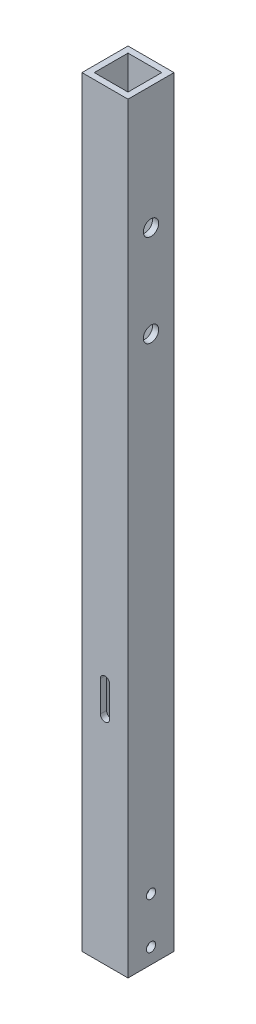
ISO-10303-21;
HEADER;
FILE_DESCRIPTION(('STEP AP214'),'2;1');
FILE_NAME('part.step','',(''),(''),'','','');
FILE_SCHEMA(('AUTOMOTIVE_DESIGN { 1 0 10303 214 1 1 1 1 }'));
ENDSEC;
DATA;
#1=APPLICATION_CONTEXT('core data for automotive mechanical design processes');
#2=APPLICATION_PROTOCOL_DEFINITION('international standard','automotive_design',2000,#1);
#3=PRODUCT_CONTEXT('',#1,'mechanical');
#4=PRODUCT('Part','Part','',(#3));
#5=PRODUCT_RELATED_PRODUCT_CATEGORY('part','',(#4));
#6=PRODUCT_DEFINITION_FORMATION('','',#4);
#7=PRODUCT_DEFINITION_CONTEXT('part definition',#1,'design');
#8=PRODUCT_DEFINITION('design','',#6,#7);
#9=PRODUCT_DEFINITION_SHAPE('','',#8);
#10=(LENGTH_UNIT() NAMED_UNIT(*) SI_UNIT(.MILLI.,.METRE.));
#11=(NAMED_UNIT(*) PLANE_ANGLE_UNIT() SI_UNIT($,.RADIAN.));
#12=(NAMED_UNIT(*) SI_UNIT($,.STERADIAN.) SOLID_ANGLE_UNIT());
#13=UNCERTAINTY_MEASURE_WITH_UNIT(LENGTH_MEASURE(1.E-05),#10,'distance_accuracy_value','');
#14=(GEOMETRIC_REPRESENTATION_CONTEXT(3) GLOBAL_UNCERTAINTY_ASSIGNED_CONTEXT((#13)) GLOBAL_UNIT_ASSIGNED_CONTEXT((#10,
#11,#12)) REPRESENTATION_CONTEXT('',''));
#15=CARTESIAN_POINT('',(0.,0.,0.));
#16=DIRECTION('',(0.,0.,1.));
#17=DIRECTION('',(1.,0.,0.));
#18=AXIS2_PLACEMENT_3D('',#15,#16,#17);
#19=CARTESIAN_POINT('',(-7.5,20.,0.));
#20=DIRECTION('',(1.,0.,0.));
#21=DIRECTION('',(0.,0.,-1.));
#22=AXIS2_PLACEMENT_3D('',#19,#20,#21);
#23=CYLINDRICAL_SURFACE('',#22,1.5);
#24=CARTESIAN_POINT('',(5.5,20.,0.));
#25=DIRECTION('',(1.,0.,0.));
#26=DIRECTION('',(0.,0.,-1.));
#27=AXIS2_PLACEMENT_3D('',#24,#25,#26);
#28=CIRCLE('',#27,1.5);
#29=CARTESIAN_POINT('',(5.5,20.,-1.5));
#30=VERTEX_POINT('',#29);
#31=EDGE_CURVE('E214',#30,#30,#28,.F.);
#32=ORIENTED_EDGE('',*,*,#31,.T.);
#33=EDGE_LOOP('',(#32));
#34=FACE_BOUND('',#33,.T.);
#35=CARTESIAN_POINT('',(7.5,20.,0.));
#36=DIRECTION('',(1.,0.,0.));
#37=DIRECTION('',(0.,0.,-1.));
#38=AXIS2_PLACEMENT_3D('',#35,#36,#37);
#39=CIRCLE('',#38,1.5);
#40=CARTESIAN_POINT('',(7.5,20.,-1.5));
#41=VERTEX_POINT('',#40);
#42=EDGE_CURVE('E245',#41,#41,#39,.T.);
#43=ORIENTED_EDGE('',*,*,#42,.T.);
#44=EDGE_LOOP('',(#43));
#45=FACE_BOUND('',#44,.T.);
#46=ADVANCED_FACE('F35',(#34,#45),#23,.F.);
#47=CARTESIAN_POINT('',(-7.5,5.,0.));
#48=DIRECTION('',(1.,0.,0.));
#49=DIRECTION('',(0.,0.,-1.));
#50=AXIS2_PLACEMENT_3D('',#47,#48,#49);
#51=CYLINDRICAL_SURFACE('',#50,1.5);
#52=CARTESIAN_POINT('',(5.5,5.,0.));
#53=DIRECTION('',(1.,0.,0.));
#54=DIRECTION('',(0.,0.,-1.));
#55=AXIS2_PLACEMENT_3D('',#52,#53,#54);
#56=CIRCLE('',#55,1.5);
#57=CARTESIAN_POINT('',(5.5,5.,-1.5));
#58=VERTEX_POINT('',#57);
#59=EDGE_CURVE('E213',#58,#58,#56,.F.);
#60=ORIENTED_EDGE('',*,*,#59,.T.);
#61=EDGE_LOOP('',(#60));
#62=FACE_BOUND('',#61,.T.);
#63=CARTESIAN_POINT('',(7.5,5.,0.));
#64=DIRECTION('',(1.,0.,0.));
#65=DIRECTION('',(0.,0.,-1.));
#66=AXIS2_PLACEMENT_3D('',#63,#64,#65);
#67=CIRCLE('',#66,1.5);
#68=CARTESIAN_POINT('',(7.5,5.,-1.5));
#69=VERTEX_POINT('',#68);
#70=EDGE_CURVE('E262',#69,#69,#67,.T.);
#71=ORIENTED_EDGE('',*,*,#70,.T.);
#72=EDGE_LOOP('',(#71));
#73=FACE_BOUND('',#72,.T.);
#74=ADVANCED_FACE('F363',(#62,#73),#51,.F.);
#75=CARTESIAN_POINT('',(0.,70.,-7.5));
#76=DIRECTION('',(0.,0.,1.));
#77=DIRECTION('',(1.,0.,0.));
#78=AXIS2_PLACEMENT_3D('',#75,#76,#77);
#79=CYLINDRICAL_SURFACE('',#78,1.5);
#80=DIRECTION('',(0.,0.,1.));
#81=VECTOR('',#80,1.);
#82=CARTESIAN_POINT('',(1.5,70.,-7.5));
#83=LINE('',#82,#81);
#84=CARTESIAN_POINT('',(1.5,70.,5.5));
#85=VERTEX_POINT('',#84);
#86=CARTESIAN_POINT('',(1.5,70.,7.5));
#87=VERTEX_POINT('',#86);
#88=EDGE_CURVE('E231',#85,#87,#83,.T.);
#89=ORIENTED_EDGE('',*,*,#88,.F.);
#90=CARTESIAN_POINT('',(0.,70.,5.5));
#91=DIRECTION('',(0.,0.,1.));
#92=DIRECTION('',(1.,0.,0.));
#93=AXIS2_PLACEMENT_3D('',#90,#91,#92);
#94=CIRCLE('',#93,1.5);
#95=CARTESIAN_POINT('',(-1.5,70.,5.5));
#96=VERTEX_POINT('',#95);
#97=EDGE_CURVE('E206',#85,#96,#94,.F.);
#98=ORIENTED_EDGE('',*,*,#97,.T.);
#99=DIRECTION('',(0.,0.,1.));
#100=VECTOR('',#99,1.);
#101=CARTESIAN_POINT('',(-1.5,70.,-7.5));
#102=LINE('',#101,#100);
#103=CARTESIAN_POINT('',(-1.5,70.,7.5));
#104=VERTEX_POINT('',#103);
#105=EDGE_CURVE('E246',#96,#104,#102,.T.);
#106=ORIENTED_EDGE('',*,*,#105,.T.);
#107=CARTESIAN_POINT('',(0.,70.,7.5));
#108=DIRECTION('',(0.,0.,1.));
#109=DIRECTION('',(1.,0.,0.));
#110=AXIS2_PLACEMENT_3D('',#107,#108,#109);
#111=CIRCLE('',#110,1.5);
#112=EDGE_CURVE('E217',#104,#87,#111,.T.);
#113=ORIENTED_EDGE('',*,*,#112,.T.);
#114=EDGE_LOOP('',(#89,#98,#106,#113));
#115=FACE_BOUND('',#114,.T.);
#116=ADVANCED_FACE('F370',(#115),#79,.F.);
#117=CARTESIAN_POINT('',(-1.5,70.,-7.5));
#118=DIRECTION('',(-1.,0.,0.));
#119=DIRECTION('',(0.,-1.,0.));
#120=AXIS2_PLACEMENT_3D('',#117,#118,#119);
#121=PLANE('',#120);
#122=ORIENTED_EDGE('',*,*,#105,.F.);
#123=DIRECTION('',(0.,1.,0.));
#124=VECTOR('',#123,1.);
#125=CARTESIAN_POINT('',(-1.5,70.,5.5));
#126=LINE('',#125,#124);
#127=CARTESIAN_POINT('',(-1.5,80.,5.5));
#128=VERTEX_POINT('',#127);
#129=EDGE_CURVE('E203',#96,#128,#126,.T.);
#130=ORIENTED_EDGE('',*,*,#129,.T.);
#131=DIRECTION('',(0.,0.,1.));
#132=VECTOR('',#131,1.);
#133=CARTESIAN_POINT('',(-1.5,80.,-7.5));
#134=LINE('',#133,#132);
#135=CARTESIAN_POINT('',(-1.5,80.,7.5));
#136=VERTEX_POINT('',#135);
#137=EDGE_CURVE('E250',#128,#136,#134,.T.);
#138=ORIENTED_EDGE('',*,*,#137,.T.);
#139=DIRECTION('',(0.,-1.,0.));
#140=VECTOR('',#139,1.);
#141=CARTESIAN_POINT('',(-1.5,70.,7.5));
#142=LINE('',#141,#140);
#143=EDGE_CURVE('E222',#136,#104,#142,.T.);
#144=ORIENTED_EDGE('',*,*,#143,.T.);
#145=EDGE_LOOP('',(#122,#130,#138,#144));
#146=FACE_BOUND('',#145,.T.);
#147=ADVANCED_FACE('F413',(#146),#121,.F.);
#148=CARTESIAN_POINT('',(0.,80.,-7.5));
#149=DIRECTION('',(0.,0.,1.));
#150=DIRECTION('',(1.,0.,0.));
#151=AXIS2_PLACEMENT_3D('',#148,#149,#150);
#152=CYLINDRICAL_SURFACE('',#151,1.5);
#153=ORIENTED_EDGE('',*,*,#137,.F.);
#154=CARTESIAN_POINT('',(0.,80.,5.5));
#155=DIRECTION('',(0.,0.,1.));
#156=DIRECTION('',(1.,0.,0.));
#157=AXIS2_PLACEMENT_3D('',#154,#155,#156);
#158=CIRCLE('',#157,1.5);
#159=CARTESIAN_POINT('',(1.5,80.,5.5));
#160=VERTEX_POINT('',#159);
#161=EDGE_CURVE('E200',#128,#160,#158,.F.);
#162=ORIENTED_EDGE('',*,*,#161,.T.);
#163=DIRECTION('',(0.,0.,1.));
#164=VECTOR('',#163,1.);
#165=CARTESIAN_POINT('',(1.5,80.,-7.5));
#166=LINE('',#165,#164);
#167=CARTESIAN_POINT('',(1.5,80.,7.5));
#168=VERTEX_POINT('',#167);
#169=EDGE_CURVE('E254',#160,#168,#166,.T.);
#170=ORIENTED_EDGE('',*,*,#169,.T.);
#171=CARTESIAN_POINT('',(0.,80.,7.5));
#172=DIRECTION('',(0.,0.,1.));
#173=DIRECTION('',(1.,0.,0.));
#174=AXIS2_PLACEMENT_3D('',#171,#172,#173);
#175=CIRCLE('',#174,1.5);
#176=EDGE_CURVE('E237',#168,#136,#175,.T.);
#177=ORIENTED_EDGE('',*,*,#176,.T.);
#178=EDGE_LOOP('',(#153,#162,#170,#177));
#179=FACE_BOUND('',#178,.T.);
#180=ADVANCED_FACE('F417',(#179),#152,.F.);
#181=CARTESIAN_POINT('',(1.5,70.,-7.5));
#182=DIRECTION('',(1.,0.,0.));
#183=DIRECTION('',(0.,1.,0.));
#184=AXIS2_PLACEMENT_3D('',#181,#182,#183);
#185=PLANE('',#184);
#186=ORIENTED_EDGE('',*,*,#169,.F.);
#187=DIRECTION('',(0.,-1.,0.));
#188=VECTOR('',#187,1.);
#189=CARTESIAN_POINT('',(1.5,70.,5.5));
#190=LINE('',#189,#188);
#191=EDGE_CURVE('E11',#160,#85,#190,.T.);
#192=ORIENTED_EDGE('',*,*,#191,.T.);
#193=ORIENTED_EDGE('',*,*,#88,.T.);
#194=DIRECTION('',(0.,1.,0.));
#195=VECTOR('',#194,1.);
#196=CARTESIAN_POINT('',(1.5,70.,7.5));
#197=LINE('',#196,#195);
#198=EDGE_CURVE('E234',#87,#168,#197,.T.);
#199=ORIENTED_EDGE('',*,*,#198,.T.);
#200=EDGE_LOOP('',(#186,#192,#193,#199));
#201=FACE_BOUND('',#200,.T.);
#202=ADVANCED_FACE('F361',(#201),#185,.F.);
#203=CARTESIAN_POINT('',(7.5,248.,7.5));
#204=DIRECTION('',(-1.,0.,0.));
#205=DIRECTION('',(0.,0.,1.));
#206=AXIS2_PLACEMENT_3D('',#203,#204,#205);
#207=PLANE('',#206);
#208=CARTESIAN_POINT('',(7.5,208.,0.));
#209=DIRECTION('',(-1.,0.,0.));
#210=DIRECTION('',(0.,0.,1.));
#211=AXIS2_PLACEMENT_3D('',#208,#209,#210);
#212=CIRCLE('',#211,2.50000000000001);
#213=CARTESIAN_POINT('',(7.5,208.,2.50000000000001));
#214=VERTEX_POINT('',#213);
#215=EDGE_CURVE('E307',#214,#214,#212,.T.);
#216=ORIENTED_EDGE('',*,*,#215,.T.);
#217=EDGE_LOOP('',(#216));
#218=FACE_BOUND('',#217,.T.);
#219=CARTESIAN_POINT('',(7.5,178.,0.));
#220=DIRECTION('',(-1.,0.,0.));
#221=DIRECTION('',(0.,0.,1.));
#222=AXIS2_PLACEMENT_3D('',#219,#220,#221);
#223=CIRCLE('',#222,2.5);
#224=CARTESIAN_POINT('',(7.5,178.,2.5));
#225=VERTEX_POINT('',#224);
#226=EDGE_CURVE('E317',#225,#225,#223,.T.);
#227=ORIENTED_EDGE('',*,*,#226,.T.);
#228=EDGE_LOOP('',(#227));
#229=FACE_BOUND('',#228,.T.);
#230=ORIENTED_EDGE('',*,*,#70,.F.);
#231=EDGE_LOOP('',(#230));
#232=FACE_BOUND('',#231,.T.);
#233=ORIENTED_EDGE('',*,*,#42,.F.);
#234=EDGE_LOOP('',(#233));
#235=FACE_BOUND('',#234,.T.);
#236=DIRECTION('',(0.,0.,-1.));
#237=VECTOR('',#236,1.);
#238=CARTESIAN_POINT('',(7.5,0.,7.5));
#239=LINE('',#238,#237);
#240=CARTESIAN_POINT('',(7.5,0.,7.5));
#241=VERTEX_POINT('',#240);
#242=CARTESIAN_POINT('',(7.5,0.,-7.5));
#243=VERTEX_POINT('',#242);
#244=EDGE_CURVE('E261',#241,#243,#239,.T.);
#245=ORIENTED_EDGE('',*,*,#244,.T.);
#246=DIRECTION('',(0.,-1.,0.));
#247=VECTOR('',#246,1.);
#248=CARTESIAN_POINT('',(7.5,248.,-7.5));
#249=LINE('',#248,#247);
#250=CARTESIAN_POINT('',(7.5,248.,-7.5));
#251=VERTEX_POINT('',#250);
#252=EDGE_CURVE('E296',#251,#243,#249,.T.);
#253=ORIENTED_EDGE('',*,*,#252,.F.);
#254=DIRECTION('',(0.,0.,-1.));
#255=VECTOR('',#254,1.);
#256=CARTESIAN_POINT('',(7.5,248.,7.5));
#257=LINE('',#256,#255);
#258=CARTESIAN_POINT('',(7.5,248.,7.5));
#259=VERTEX_POINT('',#258);
#260=EDGE_CURVE('E270',#259,#251,#257,.T.);
#261=ORIENTED_EDGE('',*,*,#260,.F.);
#262=DIRECTION('',(0.,-1.,0.));
#263=VECTOR('',#262,1.);
#264=CARTESIAN_POINT('',(7.5,248.,7.5));
#265=LINE('',#264,#263);
#266=EDGE_CURVE('E280',#259,#241,#265,.T.);
#267=ORIENTED_EDGE('',*,*,#266,.T.);
#268=EDGE_LOOP('',(#245,#253,#261,#267));
#269=FACE_BOUND('',#268,.T.);
#270=ADVANCED_FACE('F37',(#218,#229,#232,#235,#269),#207,.F.);
#271=CARTESIAN_POINT('',(-7.5,248.,-7.5));
#272=DIRECTION('',(0.,0.,1.));
#273=DIRECTION('',(1.,0.,0.));
#274=AXIS2_PLACEMENT_3D('',#271,#272,#273);
#275=PLANE('',#274);
#276=DIRECTION('',(0.,-1.,0.));
#277=VECTOR('',#276,1.);
#278=CARTESIAN_POINT('',(-1.5,70.,-7.5));
#279=LINE('',#278,#277);
#280=CARTESIAN_POINT('',(-1.5,80.,-7.5));
#281=VERTEX_POINT('',#280);
#282=CARTESIAN_POINT('',(-1.5,70.,-7.5));
#283=VERTEX_POINT('',#282);
#284=EDGE_CURVE('E228',#281,#283,#279,.T.);
#285=ORIENTED_EDGE('',*,*,#284,.T.);
#286=CARTESIAN_POINT('',(0.,70.,-7.5));
#287=DIRECTION('',(0.,0.,1.));
#288=DIRECTION('',(1.,0.,0.));
#289=AXIS2_PLACEMENT_3D('',#286,#287,#288);
#290=CIRCLE('',#289,1.5);
#291=CARTESIAN_POINT('',(1.5,70.,-7.5));
#292=VERTEX_POINT('',#291);
#293=EDGE_CURVE('E218',#283,#292,#290,.T.);
#294=ORIENTED_EDGE('',*,*,#293,.T.);
#295=DIRECTION('',(0.,1.,0.));
#296=VECTOR('',#295,1.);
#297=CARTESIAN_POINT('',(1.5,70.,-7.5));
#298=LINE('',#297,#296);
#299=CARTESIAN_POINT('',(1.5,80.,-7.5));
#300=VERTEX_POINT('',#299);
#301=EDGE_CURVE('E221',#292,#300,#298,.T.);
#302=ORIENTED_EDGE('',*,*,#301,.T.);
#303=CARTESIAN_POINT('',(0.,80.,-7.5));
#304=DIRECTION('',(0.,0.,1.));
#305=DIRECTION('',(1.,0.,0.));
#306=AXIS2_PLACEMENT_3D('',#303,#304,#305);
#307=CIRCLE('',#306,1.5);
#308=EDGE_CURVE('E225',#300,#281,#307,.T.);
#309=ORIENTED_EDGE('',*,*,#308,.T.);
#310=EDGE_LOOP('',(#285,#294,#302,#309));
#311=FACE_BOUND('',#310,.T.);
#312=DIRECTION('',(-1.,0.,0.));
#313=VECTOR('',#312,1.);
#314=CARTESIAN_POINT('',(-7.5,0.,-7.5));
#315=LINE('',#314,#313);
#316=CARTESIAN_POINT('',(-7.5,0.,-7.5));
#317=VERTEX_POINT('',#316);
#318=EDGE_CURVE('E283',#243,#317,#315,.T.);
#319=ORIENTED_EDGE('',*,*,#318,.T.);
#320=DIRECTION('',(0.,-1.,0.));
#321=VECTOR('',#320,1.);
#322=CARTESIAN_POINT('',(-7.5,248.,-7.5));
#323=LINE('',#322,#321);
#324=CARTESIAN_POINT('',(-7.5,248.,-7.5));
#325=VERTEX_POINT('',#324);
#326=EDGE_CURVE('E293',#325,#317,#323,.T.);
#327=ORIENTED_EDGE('',*,*,#326,.F.);
#328=DIRECTION('',(-1.,0.,0.));
#329=VECTOR('',#328,1.);
#330=CARTESIAN_POINT('',(-7.5,248.,-7.5));
#331=LINE('',#330,#329);
#332=EDGE_CURVE('E273',#251,#325,#331,.T.);
#333=ORIENTED_EDGE('',*,*,#332,.F.);
#334=ORIENTED_EDGE('',*,*,#252,.T.);
#335=EDGE_LOOP('',(#319,#327,#333,#334));
#336=FACE_BOUND('',#335,.T.);
#337=ADVANCED_FACE('F333',(#311,#336),#275,.F.);
#338=CARTESIAN_POINT('',(-7.5,248.,7.5));
#339=DIRECTION('',(1.,0.,0.));
#340=DIRECTION('',(0.,0.,-1.));
#341=AXIS2_PLACEMENT_3D('',#338,#339,#340);
#342=PLANE('',#341);
#343=CARTESIAN_POINT('',(-7.5,208.,0.));
#344=DIRECTION('',(-1.,0.,0.));
#345=DIRECTION('',(0.,0.,1.));
#346=AXIS2_PLACEMENT_3D('',#343,#344,#345);
#347=CIRCLE('',#346,2.50000000000001);
#348=CARTESIAN_POINT('',(-7.5,208.,2.50000000000001));
#349=VERTEX_POINT('',#348);
#350=EDGE_CURVE('E312',#349,#349,#347,.T.);
#351=ORIENTED_EDGE('',*,*,#350,.F.);
#352=EDGE_LOOP('',(#351));
#353=FACE_BOUND('',#352,.T.);
#354=CARTESIAN_POINT('',(-7.5,178.,0.));
#355=DIRECTION('',(-1.,0.,0.));
#356=DIRECTION('',(0.,0.,1.));
#357=AXIS2_PLACEMENT_3D('',#354,#355,#356);
#358=CIRCLE('',#357,2.5);
#359=CARTESIAN_POINT('',(-7.5,178.,2.5));
#360=VERTEX_POINT('',#359);
#361=EDGE_CURVE('E322',#360,#360,#358,.T.);
#362=ORIENTED_EDGE('',*,*,#361,.F.);
#363=EDGE_LOOP('',(#362));
#364=FACE_BOUND('',#363,.T.);
#365=CARTESIAN_POINT('',(-7.5,5.,0.));
#366=DIRECTION('',(1.,0.,0.));
#367=DIRECTION('',(0.,0.,-1.));
#368=AXIS2_PLACEMENT_3D('',#365,#366,#367);
#369=CIRCLE('',#368,1.5);
#370=CARTESIAN_POINT('',(-7.5,5.,-1.5));
#371=VERTEX_POINT('',#370);
#372=EDGE_CURVE('E258',#371,#371,#369,.T.);
#373=ORIENTED_EDGE('',*,*,#372,.T.);
#374=EDGE_LOOP('',(#373));
#375=FACE_BOUND('',#374,.T.);
#376=CARTESIAN_POINT('',(-7.5,20.,0.));
#377=DIRECTION('',(1.,0.,0.));
#378=DIRECTION('',(0.,0.,-1.));
#379=AXIS2_PLACEMENT_3D('',#376,#377,#378);
#380=CIRCLE('',#379,1.5);
#381=CARTESIAN_POINT('',(-7.5,20.,-1.5));
#382=VERTEX_POINT('',#381);
#383=EDGE_CURVE('E265',#382,#382,#380,.T.);
#384=ORIENTED_EDGE('',*,*,#383,.T.);
#385=EDGE_LOOP('',(#384));
#386=FACE_BOUND('',#385,.T.);
#387=DIRECTION('',(0.,0.,1.));
#388=VECTOR('',#387,1.);
#389=CARTESIAN_POINT('',(-7.5,0.,7.5));
#390=LINE('',#389,#388);
#391=CARTESIAN_POINT('',(-7.5,0.,7.5));
#392=VERTEX_POINT('',#391);
#393=EDGE_CURVE('E285',#317,#392,#390,.T.);
#394=ORIENTED_EDGE('',*,*,#393,.T.);
#395=DIRECTION('',(0.,-1.,0.));
#396=VECTOR('',#395,1.);
#397=CARTESIAN_POINT('',(-7.5,248.,7.5));
#398=LINE('',#397,#396);
#399=CARTESIAN_POINT('',(-7.5,248.,7.5));
#400=VERTEX_POINT('',#399);
#401=EDGE_CURVE('E290',#400,#392,#398,.T.);
#402=ORIENTED_EDGE('',*,*,#401,.F.);
#403=DIRECTION('',(0.,0.,1.));
#404=VECTOR('',#403,1.);
#405=CARTESIAN_POINT('',(-7.5,248.,7.5));
#406=LINE('',#405,#404);
#407=EDGE_CURVE('E276',#325,#400,#406,.T.);
#408=ORIENTED_EDGE('',*,*,#407,.F.);
#409=ORIENTED_EDGE('',*,*,#326,.T.);
#410=EDGE_LOOP('',(#394,#402,#408,#409));
#411=FACE_BOUND('',#410,.T.);
#412=ADVANCED_FACE('F329',(#353,#364,#375,#386,#411),#342,.F.);
#413=CARTESIAN_POINT('',(-7.5,248.,7.5));
#414=DIRECTION('',(0.,0.,-1.));
#415=DIRECTION('',(-1.,0.,0.));
#416=AXIS2_PLACEMENT_3D('',#413,#414,#415);
#417=PLANE('',#416);
#418=ORIENTED_EDGE('',*,*,#198,.F.);
#419=ORIENTED_EDGE('',*,*,#112,.F.);
#420=ORIENTED_EDGE('',*,*,#143,.F.);
#421=ORIENTED_EDGE('',*,*,#176,.F.);
#422=EDGE_LOOP('',(#418,#419,#420,#421));
#423=FACE_BOUND('',#422,.T.);
#424=DIRECTION('',(1.,0.,0.));
#425=VECTOR('',#424,1.);
#426=CARTESIAN_POINT('',(-7.5,0.,7.5));
#427=LINE('',#426,#425);
#428=EDGE_CURVE('E274',#392,#241,#427,.T.);
#429=ORIENTED_EDGE('',*,*,#428,.T.);
#430=ORIENTED_EDGE('',*,*,#266,.F.);
#431=DIRECTION('',(1.,0.,0.));
#432=VECTOR('',#431,1.);
#433=CARTESIAN_POINT('',(-7.5,248.,7.5));
#434=LINE('',#433,#432);
#435=EDGE_CURVE('E278',#400,#259,#434,.T.);
#436=ORIENTED_EDGE('',*,*,#435,.F.);
#437=ORIENTED_EDGE('',*,*,#401,.T.);
#438=EDGE_LOOP('',(#429,#430,#436,#437));
#439=FACE_BOUND('',#438,.T.);
#440=ADVANCED_FACE('F332',(#423,#439),#417,.F.);
#441=CARTESIAN_POINT('',(0.,248.,0.));
#442=DIRECTION('',(0.,-1.,0.));
#443=DIRECTION('',(0.,0.,-1.));
#444=AXIS2_PLACEMENT_3D('',#441,#442,#443);
#445=PLANE('',#444);
#446=DIRECTION('',(-1.,0.,0.));
#447=VECTOR('',#446,1.);
#448=CARTESIAN_POINT('',(-5.5,248.,-5.5));
#449=LINE('',#448,#447);
#450=CARTESIAN_POINT('',(5.5,248.,-5.5));
#451=VERTEX_POINT('',#450);
#452=CARTESIAN_POINT('',(-5.5,248.,-5.5));
#453=VERTEX_POINT('',#452);
#454=EDGE_CURVE('E182',#451,#453,#449,.T.);
#455=ORIENTED_EDGE('',*,*,#454,.F.);
#456=DIRECTION('',(0.,0.,-1.));
#457=VECTOR('',#456,1.);
#458=CARTESIAN_POINT('',(5.5,248.,-5.5));
#459=LINE('',#458,#457);
#460=CARTESIAN_POINT('',(5.5,248.,5.5));
#461=VERTEX_POINT('',#460);
#462=EDGE_CURVE('E52',#461,#451,#459,.T.);
#463=ORIENTED_EDGE('',*,*,#462,.F.);
#464=DIRECTION('',(1.,0.,0.));
#465=VECTOR('',#464,1.);
#466=CARTESIAN_POINT('',(-5.5,248.,5.5));
#467=LINE('',#466,#465);
#468=CARTESIAN_POINT('',(-5.5,248.,5.5));
#469=VERTEX_POINT('',#468);
#470=EDGE_CURVE('E170',#469,#461,#467,.T.);
#471=ORIENTED_EDGE('',*,*,#470,.F.);
#472=DIRECTION('',(0.,0.,1.));
#473=VECTOR('',#472,1.);
#474=CARTESIAN_POINT('',(-5.5,248.,-5.5));
#475=LINE('',#474,#473);
#476=EDGE_CURVE('E173',#453,#469,#475,.T.);
#477=ORIENTED_EDGE('',*,*,#476,.F.);
#478=EDGE_LOOP('',(#455,#463,#471,#477));
#479=FACE_BOUND('',#478,.T.);
#480=ORIENTED_EDGE('',*,*,#260,.T.);
#481=ORIENTED_EDGE('',*,*,#332,.T.);
#482=ORIENTED_EDGE('',*,*,#407,.T.);
#483=ORIENTED_EDGE('',*,*,#435,.T.);
#484=EDGE_LOOP('',(#480,#481,#482,#483));
#485=FACE_BOUND('',#484,.T.);
#486=ADVANCED_FACE('F353',(#479,#485),#445,.F.);
#487=CARTESIAN_POINT('',(0.,0.,0.));
#488=DIRECTION('',(0.,-1.,0.));
#489=DIRECTION('',(0.,0.,-1.));
#490=AXIS2_PLACEMENT_3D('',#487,#488,#489);
#491=PLANE('',#490);
#492=DIRECTION('',(0.,0.,-1.));
#493=VECTOR('',#492,1.);
#494=CARTESIAN_POINT('',(5.5,0.,-5.5));
#495=LINE('',#494,#493);
#496=CARTESIAN_POINT('',(5.5,0.,5.5));
#497=VERTEX_POINT('',#496);
#498=CARTESIAN_POINT('',(5.5,0.,-5.5));
#499=VERTEX_POINT('',#498);
#500=EDGE_CURVE('E153',#497,#499,#495,.T.);
#501=ORIENTED_EDGE('',*,*,#500,.T.);
#502=DIRECTION('',(-1.,0.,0.));
#503=VECTOR('',#502,1.);
#504=CARTESIAN_POINT('',(-5.5,0.,-5.5));
#505=LINE('',#504,#503);
#506=CARTESIAN_POINT('',(-5.5,0.,-5.5));
#507=VERTEX_POINT('',#506);
#508=EDGE_CURVE('E162',#499,#507,#505,.T.);
#509=ORIENTED_EDGE('',*,*,#508,.T.);
#510=DIRECTION('',(0.,0.,1.));
#511=VECTOR('',#510,1.);
#512=CARTESIAN_POINT('',(-5.5,0.,-5.5));
#513=LINE('',#512,#511);
#514=CARTESIAN_POINT('',(-5.5,0.,5.5));
#515=VERTEX_POINT('',#514);
#516=EDGE_CURVE('E60',#507,#515,#513,.T.);
#517=ORIENTED_EDGE('',*,*,#516,.T.);
#518=DIRECTION('',(1.,0.,0.));
#519=VECTOR('',#518,1.);
#520=CARTESIAN_POINT('',(-5.5,0.,5.5));
#521=LINE('',#520,#519);
#522=EDGE_CURVE('E159',#515,#497,#521,.T.);
#523=ORIENTED_EDGE('',*,*,#522,.T.);
#524=EDGE_LOOP('',(#501,#509,#517,#523));
#525=FACE_BOUND('',#524,.T.);
#526=ORIENTED_EDGE('',*,*,#244,.F.);
#527=ORIENTED_EDGE('',*,*,#428,.F.);
#528=ORIENTED_EDGE('',*,*,#393,.F.);
#529=ORIENTED_EDGE('',*,*,#318,.F.);
#530=EDGE_LOOP('',(#526,#527,#528,#529));
#531=FACE_BOUND('',#530,.T.);
#532=ADVANCED_FACE('F167',(#525,#531),#491,.T.);
#533=CARTESIAN_POINT('',(-5.5,20.,0.));
#534=DIRECTION('',(-1.,0.,0.));
#535=DIRECTION('',(0.,0.,1.));
#536=AXIS2_PLACEMENT_3D('',#533,#534,#535);
#537=CIRCLE('',#536,1.5);
#538=CARTESIAN_POINT('',(-5.5,20.,1.5));
#539=VERTEX_POINT('',#538);
#540=EDGE_CURVE('E210',#539,#539,#537,.F.);
#541=ORIENTED_EDGE('',*,*,#540,.T.);
#542=EDGE_LOOP('',(#541));
#543=FACE_BOUND('',#542,.T.);
#544=ORIENTED_EDGE('',*,*,#383,.F.);
#545=EDGE_LOOP('',(#544));
#546=FACE_BOUND('',#545,.T.);
#547=ADVANCED_FACE('F366',(#543,#546),#23,.F.);
#548=CARTESIAN_POINT('',(-5.5,5.,0.));
#549=DIRECTION('',(-1.,0.,0.));
#550=DIRECTION('',(0.,0.,1.));
#551=AXIS2_PLACEMENT_3D('',#548,#549,#550);
#552=CIRCLE('',#551,1.5);
#553=CARTESIAN_POINT('',(-5.5,5.,1.5));
#554=VERTEX_POINT('',#553);
#555=EDGE_CURVE('E209',#554,#554,#552,.F.);
#556=ORIENTED_EDGE('',*,*,#555,.T.);
#557=EDGE_LOOP('',(#556));
#558=FACE_BOUND('',#557,.T.);
#559=ORIENTED_EDGE('',*,*,#372,.F.);
#560=EDGE_LOOP('',(#559));
#561=FACE_BOUND('',#560,.T.);
#562=ADVANCED_FACE('F373',(#558,#561),#51,.F.);
#563=CARTESIAN_POINT('',(-1.5,70.,-5.5));
#564=VERTEX_POINT('',#563);
#565=EDGE_CURVE('E242',#283,#564,#102,.T.);
#566=ORIENTED_EDGE('',*,*,#565,.T.);
#567=CARTESIAN_POINT('',(0.,70.,-5.5));
#568=DIRECTION('',(0.,0.,-1.));
#569=DIRECTION('',(-1.,0.,0.));
#570=AXIS2_PLACEMENT_3D('',#567,#568,#569);
#571=CIRCLE('',#570,1.5);
#572=CARTESIAN_POINT('',(1.5,70.,-5.5));
#573=VERTEX_POINT('',#572);
#574=EDGE_CURVE('E197',#564,#573,#571,.F.);
#575=ORIENTED_EDGE('',*,*,#574,.T.);
#576=EDGE_CURVE('E255',#292,#573,#83,.T.);
#577=ORIENTED_EDGE('',*,*,#576,.F.);
#578=ORIENTED_EDGE('',*,*,#293,.F.);
#579=EDGE_LOOP('',(#566,#575,#577,#578));
#580=FACE_BOUND('',#579,.T.);
#581=ADVANCED_FACE('F382',(#580),#79,.F.);
#582=CARTESIAN_POINT('',(-1.5,80.,-5.5));
#583=VERTEX_POINT('',#582);
#584=EDGE_CURVE('E247',#281,#583,#134,.T.);
#585=ORIENTED_EDGE('',*,*,#584,.T.);
#586=DIRECTION('',(0.,-1.,0.));
#587=VECTOR('',#586,1.);
#588=CARTESIAN_POINT('',(-1.5,70.,-5.5));
#589=LINE('',#588,#587);
#590=EDGE_CURVE('E194',#583,#564,#589,.T.);
#591=ORIENTED_EDGE('',*,*,#590,.T.);
#592=ORIENTED_EDGE('',*,*,#565,.F.);
#593=ORIENTED_EDGE('',*,*,#284,.F.);
#594=EDGE_LOOP('',(#585,#591,#592,#593));
#595=FACE_BOUND('',#594,.T.);
#596=ADVANCED_FACE('F408',(#595),#121,.F.);
#597=CARTESIAN_POINT('',(1.5,80.,-5.5));
#598=VERTEX_POINT('',#597);
#599=EDGE_CURVE('E251',#300,#598,#166,.T.);
#600=ORIENTED_EDGE('',*,*,#599,.T.);
#601=CARTESIAN_POINT('',(0.,80.,-5.5));
#602=DIRECTION('',(0.,0.,-1.));
#603=DIRECTION('',(-1.,0.,0.));
#604=AXIS2_PLACEMENT_3D('',#601,#602,#603);
#605=CIRCLE('',#604,1.5);
#606=EDGE_CURVE('E188',#598,#583,#605,.F.);
#607=ORIENTED_EDGE('',*,*,#606,.T.);
#608=ORIENTED_EDGE('',*,*,#584,.F.);
#609=ORIENTED_EDGE('',*,*,#308,.F.);
#610=EDGE_LOOP('',(#600,#607,#608,#609));
#611=FACE_BOUND('',#610,.T.);
#612=ADVANCED_FACE('F411',(#611),#152,.F.);
#613=ORIENTED_EDGE('',*,*,#576,.T.);
#614=DIRECTION('',(0.,1.,0.));
#615=VECTOR('',#614,1.);
#616=CARTESIAN_POINT('',(1.5,70.,-5.5));
#617=LINE('',#616,#615);
#618=EDGE_CURVE('E44',#573,#598,#617,.T.);
#619=ORIENTED_EDGE('',*,*,#618,.T.);
#620=ORIENTED_EDGE('',*,*,#599,.F.);
#621=ORIENTED_EDGE('',*,*,#301,.F.);
#622=EDGE_LOOP('',(#613,#619,#620,#621));
#623=FACE_BOUND('',#622,.T.);
#624=ADVANCED_FACE('F400',(#623),#185,.F.);
#625=CARTESIAN_POINT('',(5.5,0.,-5.5));
#626=DIRECTION('',(1.,0.,0.));
#627=DIRECTION('',(0.,0.,-1.));
#628=AXIS2_PLACEMENT_3D('',#625,#626,#627);
#629=PLANE('',#628);
#630=CARTESIAN_POINT('',(5.5,208.,0.));
#631=DIRECTION('',(1.,0.,0.));
#632=DIRECTION('',(0.,0.,-1.));
#633=AXIS2_PLACEMENT_3D('',#630,#631,#632);
#634=CIRCLE('',#633,2.50000000000001);
#635=CARTESIAN_POINT('',(5.5,208.,-2.50000000000001));
#636=VERTEX_POINT('',#635);
#637=EDGE_CURVE('E176',#636,#636,#634,.T.);
#638=ORIENTED_EDGE('',*,*,#637,.T.);
#639=EDGE_LOOP('',(#638));
#640=FACE_BOUND('',#639,.T.);
#641=CARTESIAN_POINT('',(5.5,178.,0.));
#642=DIRECTION('',(1.,0.,0.));
#643=DIRECTION('',(0.,0.,-1.));
#644=AXIS2_PLACEMENT_3D('',#641,#642,#643);
#645=CIRCLE('',#644,2.5);
#646=CARTESIAN_POINT('',(5.5,178.,-2.5));
#647=VERTEX_POINT('',#646);
#648=EDGE_CURVE('E306',#647,#647,#645,.T.);
#649=ORIENTED_EDGE('',*,*,#648,.T.);
#650=EDGE_LOOP('',(#649));
#651=FACE_BOUND('',#650,.T.);
#652=ORIENTED_EDGE('',*,*,#59,.F.);
#653=EDGE_LOOP('',(#652));
#654=FACE_BOUND('',#653,.T.);
#655=ORIENTED_EDGE('',*,*,#462,.T.);
#656=DIRECTION('',(0.,1.,0.));
#657=VECTOR('',#656,1.);
#658=CARTESIAN_POINT('',(5.5,0.,-5.5));
#659=LINE('',#658,#657);
#660=EDGE_CURVE('E148',#499,#451,#659,.T.);
#661=ORIENTED_EDGE('',*,*,#660,.F.);
#662=ORIENTED_EDGE('',*,*,#500,.F.);
#663=DIRECTION('',(0.,1.,0.));
#664=VECTOR('',#663,1.);
#665=CARTESIAN_POINT('',(5.5,0.,5.5));
#666=LINE('',#665,#664);
#667=EDGE_CURVE('E186',#497,#461,#666,.T.);
#668=ORIENTED_EDGE('',*,*,#667,.T.);
#669=EDGE_LOOP('',(#655,#661,#662,#668));
#670=FACE_BOUND('',#669,.T.);
#671=ORIENTED_EDGE('',*,*,#31,.F.);
#672=EDGE_LOOP('',(#671));
#673=FACE_BOUND('',#672,.T.);
#674=ADVANCED_FACE('F150',(#640,#651,#654,#670,#673),#629,.F.);
#675=CARTESIAN_POINT('',(-5.5,0.,-5.5));
#676=DIRECTION('',(-1.,0.,0.));
#677=DIRECTION('',(0.,0.,1.));
#678=AXIS2_PLACEMENT_3D('',#675,#676,#677);
#679=PLANE('',#678);
#680=CARTESIAN_POINT('',(-5.5,208.,0.));
#681=DIRECTION('',(-1.,0.,0.));
#682=DIRECTION('',(0.,0.,1.));
#683=AXIS2_PLACEMENT_3D('',#680,#681,#682);
#684=CIRCLE('',#683,2.50000000000001);
#685=CARTESIAN_POINT('',(-5.5,208.,2.50000000000001));
#686=VERTEX_POINT('',#685);
#687=EDGE_CURVE('E39',#686,#686,#684,.T.);
#688=ORIENTED_EDGE('',*,*,#687,.T.);
#689=EDGE_LOOP('',(#688));
#690=FACE_BOUND('',#689,.T.);
#691=CARTESIAN_POINT('',(-5.5,178.,0.));
#692=DIRECTION('',(-1.,0.,0.));
#693=DIRECTION('',(0.,0.,1.));
#694=AXIS2_PLACEMENT_3D('',#691,#692,#693);
#695=CIRCLE('',#694,2.5);
#696=CARTESIAN_POINT('',(-5.5,178.,2.5));
#697=VERTEX_POINT('',#696);
#698=EDGE_CURVE('E304',#697,#697,#695,.T.);
#699=ORIENTED_EDGE('',*,*,#698,.T.);
#700=EDGE_LOOP('',(#699));
#701=FACE_BOUND('',#700,.T.);
#702=ORIENTED_EDGE('',*,*,#555,.F.);
#703=EDGE_LOOP('',(#702));
#704=FACE_BOUND('',#703,.T.);
#705=ORIENTED_EDGE('',*,*,#476,.T.);
#706=DIRECTION('',(0.,1.,0.));
#707=VECTOR('',#706,1.);
#708=CARTESIAN_POINT('',(-5.5,0.,5.5));
#709=LINE('',#708,#707);
#710=EDGE_CURVE('E189',#515,#469,#709,.T.);
#711=ORIENTED_EDGE('',*,*,#710,.F.);
#712=ORIENTED_EDGE('',*,*,#516,.F.);
#713=DIRECTION('',(0.,1.,0.));
#714=VECTOR('',#713,1.);
#715=CARTESIAN_POINT('',(-5.5,0.,-5.5));
#716=LINE('',#715,#714);
#717=EDGE_CURVE('E158',#507,#453,#716,.T.);
#718=ORIENTED_EDGE('',*,*,#717,.T.);
#719=EDGE_LOOP('',(#705,#711,#712,#718));
#720=FACE_BOUND('',#719,.T.);
#721=ORIENTED_EDGE('',*,*,#540,.F.);
#722=EDGE_LOOP('',(#721));
#723=FACE_BOUND('',#722,.T.);
#724=ADVANCED_FACE('F388',(#690,#701,#704,#720,#723),#679,.F.);
#725=CARTESIAN_POINT('',(-5.5,0.,5.5));
#726=DIRECTION('',(0.,0.,1.));
#727=DIRECTION('',(1.,0.,0.));
#728=AXIS2_PLACEMENT_3D('',#725,#726,#727);
#729=PLANE('',#728);
#730=ORIENTED_EDGE('',*,*,#470,.T.);
#731=ORIENTED_EDGE('',*,*,#667,.F.);
#732=ORIENTED_EDGE('',*,*,#522,.F.);
#733=ORIENTED_EDGE('',*,*,#710,.T.);
#734=EDGE_LOOP('',(#730,#731,#732,#733));
#735=FACE_BOUND('',#734,.T.);
#736=ORIENTED_EDGE('',*,*,#191,.F.);
#737=ORIENTED_EDGE('',*,*,#161,.F.);
#738=ORIENTED_EDGE('',*,*,#129,.F.);
#739=ORIENTED_EDGE('',*,*,#97,.F.);
#740=EDGE_LOOP('',(#736,#737,#738,#739));
#741=FACE_BOUND('',#740,.T.);
#742=ADVANCED_FACE('F390',(#735,#741),#729,.F.);
#743=CARTESIAN_POINT('',(-5.5,0.,-5.5));
#744=DIRECTION('',(0.,0.,-1.));
#745=DIRECTION('',(-1.,0.,0.));
#746=AXIS2_PLACEMENT_3D('',#743,#744,#745);
#747=PLANE('',#746);
#748=ORIENTED_EDGE('',*,*,#454,.T.);
#749=ORIENTED_EDGE('',*,*,#717,.F.);
#750=ORIENTED_EDGE('',*,*,#508,.F.);
#751=ORIENTED_EDGE('',*,*,#660,.T.);
#752=EDGE_LOOP('',(#748,#749,#750,#751));
#753=FACE_BOUND('',#752,.T.);
#754=ORIENTED_EDGE('',*,*,#590,.F.);
#755=ORIENTED_EDGE('',*,*,#606,.F.);
#756=ORIENTED_EDGE('',*,*,#618,.F.);
#757=ORIENTED_EDGE('',*,*,#574,.F.);
#758=EDGE_LOOP('',(#754,#755,#756,#757));
#759=FACE_BOUND('',#758,.T.);
#760=ADVANCED_FACE('F163',(#753,#759),#747,.F.);
#761=CARTESIAN_POINT('',(7.5,178.,0.));
#762=DIRECTION('',(-1.,0.,0.));
#763=DIRECTION('',(0.,0.,1.));
#764=AXIS2_PLACEMENT_3D('',#761,#762,#763);
#765=CYLINDRICAL_SURFACE('',#764,2.5);
#766=ORIENTED_EDGE('',*,*,#361,.T.);
#767=EDGE_LOOP('',(#766));
#768=FACE_BOUND('',#767,.T.);
#769=ORIENTED_EDGE('',*,*,#698,.F.);
#770=EDGE_LOOP('',(#769));
#771=FACE_BOUND('',#770,.T.);
#772=ADVANCED_FACE('F326',(#768,#771),#765,.F.);
#773=CARTESIAN_POINT('',(7.5,208.,0.));
#774=DIRECTION('',(-1.,0.,0.));
#775=DIRECTION('',(0.,0.,1.));
#776=AXIS2_PLACEMENT_3D('',#773,#774,#775);
#777=CYLINDRICAL_SURFACE('',#776,2.50000000000001);
#778=ORIENTED_EDGE('',*,*,#350,.T.);
#779=EDGE_LOOP('',(#778));
#780=FACE_BOUND('',#779,.T.);
#781=ORIENTED_EDGE('',*,*,#687,.F.);
#782=EDGE_LOOP('',(#781));
#783=FACE_BOUND('',#782,.T.);
#784=ADVANCED_FACE('F544',(#780,#783),#777,.F.);
#785=ORIENTED_EDGE('',*,*,#226,.F.);
#786=EDGE_LOOP('',(#785));
#787=FACE_BOUND('',#786,.T.);
#788=ORIENTED_EDGE('',*,*,#648,.F.);
#789=EDGE_LOOP('',(#788));
#790=FACE_BOUND('',#789,.T.);
#791=ADVANCED_FACE('F545',(#787,#790),#765,.F.);
#792=ORIENTED_EDGE('',*,*,#215,.F.);
#793=EDGE_LOOP('',(#792));
#794=FACE_BOUND('',#793,.T.);
#795=ORIENTED_EDGE('',*,*,#637,.F.);
#796=EDGE_LOOP('',(#795));
#797=FACE_BOUND('',#796,.T.);
#798=ADVANCED_FACE('F553',(#794,#797),#777,.F.);
#799=CLOSED_SHELL('',(#46,#74,#116,#147,#180,#202,#270,#337,#412,#440,#486,#532,#547,#562,#581,
#596,#612,#624,#674,#724,#742,#760,#772,#784,#791,#798));
#800=MANIFOLD_SOLID_BREP('B2',#799);
#801=ADVANCED_BREP_SHAPE_REPRESENTATION('',(#18,#800),#14);
#802=SHAPE_DEFINITION_REPRESENTATION(#9,#801);
ENDSEC;
END-ISO-10303-21;
